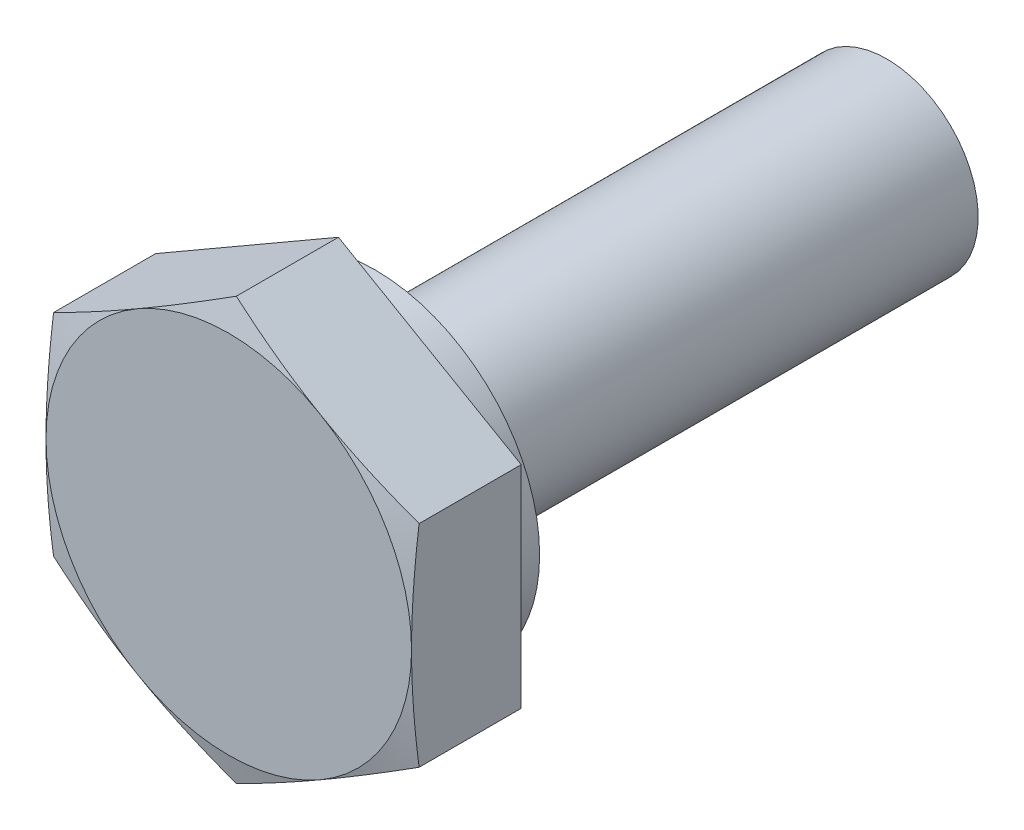
ISO-10303-21;
HEADER;
FILE_DESCRIPTION(('STEP AP214'),'2;1');
FILE_NAME('part.step','',(''),(''),'','','');
FILE_SCHEMA(('AUTOMOTIVE_DESIGN { 1 0 10303 214 1 1 1 1 }'));
ENDSEC;
DATA;
#1=APPLICATION_CONTEXT('core data for automotive mechanical design processes');
#2=APPLICATION_PROTOCOL_DEFINITION('international standard','automotive_design',2000,#1);
#3=PRODUCT_CONTEXT('',#1,'mechanical');
#4=PRODUCT('Part','Part','',(#3));
#5=PRODUCT_RELATED_PRODUCT_CATEGORY('part','',(#4));
#6=PRODUCT_DEFINITION_FORMATION('','',#4);
#7=PRODUCT_DEFINITION_CONTEXT('part definition',#1,'design');
#8=PRODUCT_DEFINITION('design','',#6,#7);
#9=PRODUCT_DEFINITION_SHAPE('','',#8);
#10=(LENGTH_UNIT() NAMED_UNIT(*) SI_UNIT(.MILLI.,.METRE.));
#11=(NAMED_UNIT(*) PLANE_ANGLE_UNIT() SI_UNIT($,.RADIAN.));
#12=(NAMED_UNIT(*) SI_UNIT($,.STERADIAN.) SOLID_ANGLE_UNIT());
#13=UNCERTAINTY_MEASURE_WITH_UNIT(LENGTH_MEASURE(1.E-05),#10,'distance_accuracy_value','');
#14=(GEOMETRIC_REPRESENTATION_CONTEXT(3) GLOBAL_UNCERTAINTY_ASSIGNED_CONTEXT((#13)) GLOBAL_UNIT_ASSIGNED_CONTEXT((#10,
#11,#12)) REPRESENTATION_CONTEXT('',''));
#15=CARTESIAN_POINT('',(0.,0.,0.));
#16=DIRECTION('',(0.,0.,1.));
#17=DIRECTION('',(1.,0.,0.));
#18=AXIS2_PLACEMENT_3D('',#15,#16,#17);
#19=CARTESIAN_POINT('',(0.,0.,-14.));
#20=DIRECTION('',(0.,0.,1.));
#21=DIRECTION('',(1.,0.,0.));
#22=AXIS2_PLACEMENT_3D('',#19,#20,#21);
#23=CYLINDRICAL_SURFACE('',#22,2.5);
#24=CARTESIAN_POINT('',(0.,0.,-14.));
#25=DIRECTION('',(0.,0.,-1.));
#26=DIRECTION('',(-1.,0.,0.));
#27=AXIS2_PLACEMENT_3D('',#24,#25,#26);
#28=CIRCLE('',#27,2.5);
#29=CARTESIAN_POINT('',(-2.5,0.,-14.));
#30=VERTEX_POINT('',#29);
#31=EDGE_CURVE('E12',#30,#30,#28,.T.);
#32=ORIENTED_EDGE('',*,*,#31,.F.);
#33=EDGE_LOOP('',(#32));
#34=FACE_BOUND('',#33,.T.);
#35=CARTESIAN_POINT('',(0.,0.,0.));
#36=DIRECTION('',(0.,0.,-1.));
#37=DIRECTION('',(-1.,0.,0.));
#38=AXIS2_PLACEMENT_3D('',#35,#36,#37);
#39=CIRCLE('',#38,2.5);
#40=CARTESIAN_POINT('',(-2.5,0.,0.));
#41=VERTEX_POINT('',#40);
#42=EDGE_CURVE('E53',#41,#41,#39,.T.);
#43=ORIENTED_EDGE('',*,*,#42,.T.);
#44=EDGE_LOOP('',(#43));
#45=FACE_BOUND('',#44,.T.);
#46=ADVANCED_FACE('F50',(#34,#45),#23,.T.);
#47=CARTESIAN_POINT('',(0.,0.,-14.));
#48=DIRECTION('',(0.,0.,-1.));
#49=DIRECTION('',(-1.,0.,0.));
#50=AXIS2_PLACEMENT_3D('',#47,#48,#49);
#51=PLANE('',#50);
#52=ORIENTED_EDGE('',*,*,#31,.T.);
#53=EDGE_LOOP('',(#52));
#54=FACE_BOUND('',#53,.T.);
#55=ADVANCED_FACE('F65',(#54),#51,.T.);
#56=CARTESIAN_POINT('',(0.,0.,0.));
#57=DIRECTION('',(0.,0.,-1.));
#58=DIRECTION('',(-1.,0.,0.));
#59=AXIS2_PLACEMENT_3D('',#56,#57,#58);
#60=PLANE('',#59);
#61=ORIENTED_EDGE('',*,*,#42,.F.);
#62=EDGE_LOOP('',(#61));
#63=FACE_BOUND('',#62,.T.);
#64=ADVANCED_FACE('F63',(#63),#60,.F.);
#65=CLOSED_SHELL('',(#46,#55,#64));
#66=MANIFOLD_SOLID_BREP('B2',#65);
#67=CARTESIAN_POINT('',(5.,2.88675134594813,4.));
#68=DIRECTION('',(-0.5,-0.866025403784439,0.));
#69=DIRECTION('',(0.866025403784439,-0.5,0.));
#70=AXIS2_PLACEMENT_3D('',#67,#68,#69);
#71=PLANE('',#70);
#72=DIRECTION('',(0.866025403784439,-0.5,0.));
#73=VECTOR('',#72,1.);
#74=CARTESIAN_POINT('',(5.,2.88675134594813,1.));
#75=LINE('',#74,#73);
#76=CARTESIAN_POINT('',(0.,5.7735026918963,1.));
#77=VERTEX_POINT('',#76);
#78=CARTESIAN_POINT('',(5.,2.88675134594813,1.));
#79=VERTEX_POINT('',#78);
#80=EDGE_CURVE('E106',#77,#79,#75,.T.);
#81=ORIENTED_EDGE('',*,*,#80,.F.);
#82=DIRECTION('',(0.,0.,-1.));
#83=VECTOR('',#82,1.);
#84=CARTESIAN_POINT('',(0.,5.77350269189626,4.));
#85=LINE('',#84,#83);
#86=CARTESIAN_POINT('',(0.,5.77350269189626,3.7927405783631));
#87=VERTEX_POINT('',#86);
#88=EDGE_CURVE('E100',#87,#77,#85,.T.);
#89=ORIENTED_EDGE('',*,*,#88,.F.);
#90=CARTESIAN_POINT('',(5.0002,2.88663587589429,3.79270963732724));
#91=CARTESIAN_POINT('',(4.79254599569433,3.00652497117847,3.824847903817));
#92=CARTESIAN_POINT('',(4.58451548167429,3.1266314444476,3.85402418697656));
#93=CARTESIAN_POINT('',(4.16771975103018,3.36726857173206,3.90528422981995));
#94=CARTESIAN_POINT('',(3.95895427067026,3.48779937801537,3.92736510843084));
#95=CARTESIAN_POINT('',(3.54195440146031,3.72855436475577,3.96314523215381));
#96=CARTESIAN_POINT('',(3.33372283258692,3.8487769170986,3.97688714813322));
#97=CARTESIAN_POINT('',(2.91699413634291,4.08937534205412,3.99531365579605));
#98=CARTESIAN_POINT('',(2.70849706817145,4.20975118048816,4.));
#99=CARTESIAN_POINT('',(2.29150293182854,4.45050285735623,4.));
#100=CARTESIAN_POINT('',(2.08300586365708,4.57087869579027,3.99531365579605));
#101=CARTESIAN_POINT('',(1.66627716741308,4.81147712074579,3.97688714813322));
#102=CARTESIAN_POINT('',(1.45804559853969,4.93169967308862,3.96314523215381));
#103=CARTESIAN_POINT('',(1.04104572932974,5.17245465982902,3.92736510843084));
#104=CARTESIAN_POINT('',(0.832280248969817,5.29298546611232,3.90528422981995));
#105=CARTESIAN_POINT('',(0.415484518325706,5.53362259339679,3.85402418697656));
#106=CARTESIAN_POINT('',(0.207454004305663,5.65372906666592,3.824847903817));
#107=CARTESIAN_POINT('',(-0.000200000000001512,5.77361816195009,3.79270963732724));
#108=B_SPLINE_CURVE_WITH_KNOTS('',3,(#90,#91,#92,#93,#94,#95,#96,#97,#98,#99,#100,#101,#102,
#103,#104,#105,#106,#107),.UNSPECIFIED.,.F.,.F.,(4,2,2,2,2,2,2,2,4),(0.,0.725805237679807,
1.45190481561532,2.17425686883392,2.89646911159516,3.6186813543564,4.341033407575,
5.06713298551051,5.79293822319032),.UNSPECIFIED.);
#109=CARTESIAN_POINT('',(2.5,4.3301270189222,4.));
#110=VERTEX_POINT('',#109);
#111=EDGE_CURVE('E210',#110,#87,#108,.T.);
#112=ORIENTED_EDGE('',*,*,#111,.F.);
#113=CARTESIAN_POINT('',(5.,2.88675134594813,3.7927405783631));
#114=VERTEX_POINT('',#113);
#115=EDGE_CURVE('E189',#114,#110,#108,.T.);
#116=ORIENTED_EDGE('',*,*,#115,.F.);
#117=DIRECTION('',(0.,0.,-1.));
#118=VECTOR('',#117,1.);
#119=CARTESIAN_POINT('',(5.,2.88675134594813,4.));
#120=LINE('',#119,#118);
#121=EDGE_CURVE('E185',#114,#79,#120,.T.);
#122=ORIENTED_EDGE('',*,*,#121,.T.);
#123=EDGE_LOOP('',(#81,#89,#112,#116,#122));
#124=FACE_BOUND('',#123,.T.);
#125=ADVANCED_FACE('F92',(#124),#71,.F.);
#126=CARTESIAN_POINT('',(0.,5.77350269189626,4.));
#127=DIRECTION('',(0.5,-0.866025403784439,0.));
#128=DIRECTION('',(0.866025403784439,0.5,0.));
#129=AXIS2_PLACEMENT_3D('',#126,#127,#128);
#130=PLANE('',#129);
#131=DIRECTION('',(0.866025403784439,0.5,0.));
#132=VECTOR('',#131,1.);
#133=CARTESIAN_POINT('',(0.,5.77350269189626,1.));
#134=LINE('',#133,#132);
#135=CARTESIAN_POINT('',(-5.,2.88675134594817,1.));
#136=VERTEX_POINT('',#135);
#137=EDGE_CURVE('E204',#136,#77,#134,.T.);
#138=ORIENTED_EDGE('',*,*,#137,.F.);
#139=DIRECTION('',(0.,0.,-1.));
#140=VECTOR('',#139,1.);
#141=CARTESIAN_POINT('',(-5.,2.88675134594813,4.));
#142=LINE('',#141,#140);
#143=CARTESIAN_POINT('',(-5.,2.88675134594813,3.7927405783631));
#144=VERTEX_POINT('',#143);
#145=EDGE_CURVE('E195',#144,#136,#142,.T.);
#146=ORIENTED_EDGE('',*,*,#145,.F.);
#147=CARTESIAN_POINT('',(0.000200000000069447,5.77361816195014,3.79270963732723));
#148=CARTESIAN_POINT('',(-0.207454004305598,5.65372906666595,3.82484790381699));
#149=CARTESIAN_POINT('',(-0.415484518325645,5.53362259339683,3.85402418697656));
#150=CARTESIAN_POINT('',(-0.832280248969761,5.29298546611236,3.90528422981994));
#151=CARTESIAN_POINT('',(-1.04104572932968,5.17245465982905,3.92736510843083));
#152=CARTESIAN_POINT('',(-1.45804559853964,4.93169967308865,3.9631452321538));
#153=CARTESIAN_POINT('',(-1.66627716741303,4.81147712074582,3.97688714813321));
#154=CARTESIAN_POINT('',(-2.08300586365704,4.5708786957903,3.99531365579605));
#155=CARTESIAN_POINT('',(-2.2915029318285,4.45050285735625,4.));
#156=CARTESIAN_POINT('',(-2.70849706817142,4.20975118048817,4.));
#157=CARTESIAN_POINT('',(-2.91699413634288,4.08937534205413,3.99531365579605));
#158=CARTESIAN_POINT('',(-3.3337228325869,3.84877691709861,3.97688714813322));
#159=CARTESIAN_POINT('',(-3.54195440146029,3.72855436475578,3.96314523215381));
#160=CARTESIAN_POINT('',(-3.95895427067025,3.48779937801537,3.92736510843084));
#161=CARTESIAN_POINT('',(-4.16771975103017,3.36726857173207,3.90528422981995));
#162=CARTESIAN_POINT('',(-4.58451548167429,3.1266314444476,3.85402418697656));
#163=CARTESIAN_POINT('',(-4.79254599569433,3.00652497117847,3.824847903817));
#164=CARTESIAN_POINT('',(-5.0002,2.88663587589429,3.79270963732724));
#165=B_SPLINE_CURVE_WITH_KNOTS('',3,(#147,#148,#149,#150,#151,#152,#153,#154,#155,#156,#157,
#158,#159,#160,#161,#162,#163,#164),.UNSPECIFIED.,.F.,.F.,(4,2,2,2,2,2,2,2,4),(0.,
0.725805237679819,1.45190481561534,2.17425686883395,2.8964691115952,3.61868135435645,
4.34103340757506,5.06713298551058,5.7929382231904),.UNSPECIFIED.);
#166=CARTESIAN_POINT('',(-2.5,4.3301270189222,4.));
#167=VERTEX_POINT('',#166);
#168=EDGE_CURVE('E272',#167,#144,#165,.T.);
#169=ORIENTED_EDGE('',*,*,#168,.F.);
#170=EDGE_CURVE('E206',#87,#167,#165,.T.);
#171=ORIENTED_EDGE('',*,*,#170,.F.);
#172=ORIENTED_EDGE('',*,*,#88,.T.);
#173=EDGE_LOOP('',(#138,#146,#169,#171,#172));
#174=FACE_BOUND('',#173,.T.);
#175=ADVANCED_FACE('F202',(#174),#130,.F.);
#176=CARTESIAN_POINT('',(-5.,2.88675134594813,4.));
#177=DIRECTION('',(1.,0.,0.));
#178=DIRECTION('',(0.,1.,0.));
#179=AXIS2_PLACEMENT_3D('',#176,#177,#178);
#180=PLANE('',#179);
#181=DIRECTION('',(0.,1.,0.));
#182=VECTOR('',#181,1.);
#183=CARTESIAN_POINT('',(-5.,2.88675134594813,1.));
#184=LINE('',#183,#182);
#185=CARTESIAN_POINT('',(-5.00000000000007,-2.88675134594809,1.));
#186=VERTEX_POINT('',#185);
#187=EDGE_CURVE('E215',#186,#136,#184,.T.);
#188=ORIENTED_EDGE('',*,*,#187,.F.);
#189=DIRECTION('',(0.,0.,-1.));
#190=VECTOR('',#189,1.);
#191=CARTESIAN_POINT('',(-5.,-2.88675134594813,4.));
#192=LINE('',#191,#190);
#193=CARTESIAN_POINT('',(-5.,-2.88675134594813,3.7927405783631));
#194=VERTEX_POINT('',#193);
#195=EDGE_CURVE('E187',#194,#186,#192,.T.);
#196=ORIENTED_EDGE('',*,*,#195,.F.);
#197=CARTESIAN_POINT('',(-5.,-7.76196101902946,2.86577469806163));
#198=CARTESIAN_POINT('',(-5.,-7.53355544640549,2.91721159108631));
#199=CARTESIAN_POINT('',(-5.,-7.30501038221311,2.96803982960013));
#200=CARTESIAN_POINT('',(-5.,-6.84757243988184,3.06815002834736));
#201=CARTESIAN_POINT('',(-5.,-6.6186795479039,3.11743192527288));
#202=CARTESIAN_POINT('',(-5.,-6.16029542621132,3.2141584906747));
#203=CARTESIAN_POINT('',(-5.,-5.93080384827886,3.26160151463753));
#204=CARTESIAN_POINT('',(-5.,-5.47135179494064,3.35415884682467));
#205=CARTESIAN_POINT('',(-5.,-5.24139132327865,3.39927317356675));
#206=CARTESIAN_POINT('',(-5.,-4.78296185288845,3.4862279803799));
#207=CARTESIAN_POINT('',(-5.,-4.55449771093611,3.52809394386246));
#208=CARTESIAN_POINT('',(-5.,-4.09695356811832,3.60830702239458));
#209=CARTESIAN_POINT('',(-5.,-3.8678735803398,3.6466542116203));
#210=CARTESIAN_POINT('',(-5.,-3.40903362894303,3.71899424972782));
#211=CARTESIAN_POINT('',(-5.,-3.17927370171718,3.75298732749157));
#212=CARTESIAN_POINT('',(-5.,-2.71901942818869,3.81564030016865));
#213=CARTESIAN_POINT('',(-5.,-2.48852508038888,3.84430018420281));
#214=CARTESIAN_POINT('',(-5.,-2.02412764678303,3.89550663603561));
#215=CARTESIAN_POINT('',(-5.,-1.79021614970132,3.91797803433157));
#216=CARTESIAN_POINT('',(-5.,-1.32177884743611,3.95527197023481));
#217=CARTESIAN_POINT('',(-5.,-1.08725305663507,3.97009468533984));
#218=CARTESIAN_POINT('',(-5.,-0.617940238864208,3.99122886719137));
#219=CARTESIAN_POINT('',(-5.,-0.383153427774166,3.99754503116479));
#220=CARTESIAN_POINT('',(-5.,0.0864917880275065,4.0012761427966));
#221=CARTESIAN_POINT('',(-5.,0.321350192547566,3.99869111406739));
#222=CARTESIAN_POINT('',(-5.,0.791864859324612,3.98475725372217));
#223=CARTESIAN_POINT('',(-5.,1.02751992497615,3.97336883174136));
#224=CARTESIAN_POINT('',(-5.,1.49830029770566,3.94247990079264));
#225=CARTESIAN_POINT('',(-5.,1.73342557530454,3.92297895110384));
#226=CARTESIAN_POINT('',(-5.,2.20314223911287,3.87688099141532));
#227=CARTESIAN_POINT('',(-5.,2.43773310846898,3.8502787970731));
#228=CARTESIAN_POINT('',(-5.,2.90615246571505,3.79112401718162));
#229=CARTESIAN_POINT('',(-5.,3.13998095657708,3.75857145485751));
#230=CARTESIAN_POINT('',(-5.,3.65460300414174,3.68145146605038));
#231=CARTESIAN_POINT('',(-5.,3.93523107751749,3.63578811875538));
#232=CARTESIAN_POINT('',(-5.,4.49555085135319,3.53901354861882));
#233=CARTESIAN_POINT('',(-5.,4.77524249961658,3.48790202714241));
#234=CARTESIAN_POINT('',(-5.,5.33388376285402,3.38148396717443));
#235=CARTESIAN_POINT('',(-5.,5.61283320547354,3.32617652965581));
#236=CARTESIAN_POINT('',(-5.,6.17006410655163,3.21233708867529));
#237=CARTESIAN_POINT('',(-5.,6.44834557822614,3.1538051495688));
#238=CARTESIAN_POINT('',(-5.,7.00453379399633,3.03419996867862));
#239=CARTESIAN_POINT('',(-5.,7.282440215283,2.97312523089704));
#240=CARTESIAN_POINT('',(-5.,7.83781244025366,2.8490010536128));
#241=CARTESIAN_POINT('',(-5.,8.1152782409337,2.78595160070767));
#242=CARTESIAN_POINT('',(-5.,8.94706574997596,2.59449096007915));
#243=CARTESIAN_POINT('',(-5.,9.50085096348015,2.46375145902359));
#244=CARTESIAN_POINT('',(-5.,10.5991357140364,2.20023970984687));
#245=CARTESIAN_POINT('',(-5.,11.1436497579981,2.06752751261781));
#246=CARTESIAN_POINT('',(-5.,12.2320324679224,1.79939890524727));
#247=CARTESIAN_POINT('',(-5.,12.7759011088251,1.66398239352181));
#248=CARTESIAN_POINT('',(-5.,13.8621201011647,1.39149952710366));
#249=CARTESIAN_POINT('',(-5.,14.404471368774,1.25443681635721));
#250=CARTESIAN_POINT('',(-5.,15.4887837905263,0.978887236203113));
#251=CARTESIAN_POINT('',(-5.,16.0307449625641,0.840400437255483));
#252=CARTESIAN_POINT('',(-5.,16.5725819500003,0.70143420342687));
#253=B_SPLINE_CURVE_WITH_KNOTS('',3,(#197,#198,#199,#200,#201,#202,#203,#204,#205,#206,#207,
#208,#209,#210,#211,#212,#213,#214,#215,#216,#217,#218,#219,#220,#221,#222,#223,#224,#225,#226,
#227,#228,#229,#230,#231,#232,#233,#234,#235,#236,#237,#238,#239,#240,#241,#242,#243,#244,#245,
#246,#247,#248,#249,#250,#251,#252),.UNSPECIFIED.,.F.,.F.,(4,2,2,2,2,2,2,2,2,2,2,2,2,2,2,2,2,2,
2,2,2,2,2,2,2,2,2,4),(0.,0.702379911672641,1.40478854166005,2.10781148965147,2.81082884635111,
3.50761218784096,4.20438083768466,4.90111284554521,5.59784627465138,6.30270276935083,
7.00754290619364,7.71199367802689,8.41644258114918,9.1240780747969,9.8317520164465,
10.539944023025,11.2481332654865,12.1010172051948,12.9539479187311,13.8070619022057,
14.6601588651796,15.5137650240013,16.3673769775346,18.0743755141688,19.7557280175381,
21.4371437979221,23.1153490570786,24.7934716789311),.UNSPECIFIED.);
#254=CARTESIAN_POINT('',(-5.,0.,4.));
#255=VERTEX_POINT('',#254);
#256=EDGE_CURVE('E264',#255,#194,#253,.F.);
#257=ORIENTED_EDGE('',*,*,#256,.F.);
#258=EDGE_CURVE('E270',#144,#255,#253,.F.);
#259=ORIENTED_EDGE('',*,*,#258,.F.);
#260=ORIENTED_EDGE('',*,*,#145,.T.);
#261=EDGE_LOOP('',(#188,#196,#257,#259,#260));
#262=FACE_BOUND('',#261,.T.);
#263=ADVANCED_FACE('F277',(#262),#180,.F.);
#264=CARTESIAN_POINT('',(-5.,-2.88675134594813,4.));
#265=DIRECTION('',(0.5,0.866025403784439,0.));
#266=DIRECTION('',(-0.866025403784439,0.5,0.));
#267=AXIS2_PLACEMENT_3D('',#264,#265,#266);
#268=PLANE('',#267);
#269=DIRECTION('',(-0.866025403784439,0.5,0.));
#270=VECTOR('',#269,1.);
#271=CARTESIAN_POINT('',(-5.,-2.88675134594813,1.));
#272=LINE('',#271,#270);
#273=CARTESIAN_POINT('',(0.,-5.7735026918963,1.));
#274=VERTEX_POINT('',#273);
#275=EDGE_CURVE('E178',#274,#186,#272,.T.);
#276=ORIENTED_EDGE('',*,*,#275,.F.);
#277=DIRECTION('',(0.,0.,-1.));
#278=VECTOR('',#277,1.);
#279=CARTESIAN_POINT('',(0.,-5.77350269189626,4.));
#280=LINE('',#279,#278);
#281=CARTESIAN_POINT('',(0.,-5.77350269189626,3.7927405783631));
#282=VERTEX_POINT('',#281);
#283=EDGE_CURVE('E177',#282,#274,#280,.T.);
#284=ORIENTED_EDGE('',*,*,#283,.F.);
#285=CARTESIAN_POINT('',(-5.00020000000007,-2.88663587589425,3.79270963732723));
#286=CARTESIAN_POINT('',(-4.7925459956944,-3.00652497117843,3.82484790381699));
#287=CARTESIAN_POINT('',(-4.58451548167436,-3.12663144444756,3.85402418697656));
#288=CARTESIAN_POINT('',(-4.16771975103024,-3.36726857173203,3.90528422981994));
#289=CARTESIAN_POINT('',(-3.95895427067032,-3.48779937801533,3.92736510843083));
#290=CARTESIAN_POINT('',(-3.54195440146036,-3.72855436475574,3.9631452321538));
#291=CARTESIAN_POINT('',(-3.33372283258697,-3.84877691709857,3.97688714813321));
#292=CARTESIAN_POINT('',(-2.91699413634295,-4.08937534205409,3.99531365579605));
#293=CARTESIAN_POINT('',(-2.70849706817149,-4.20975118048813,4.));
#294=CARTESIAN_POINT('',(-2.29150293182857,-4.45050285735621,4.));
#295=CARTESIAN_POINT('',(-2.08300586365711,-4.57087869579026,3.99531365579605));
#296=CARTESIAN_POINT('',(-1.6662771674131,-4.81147712074578,3.97688714813322));
#297=CARTESIAN_POINT('',(-1.45804559853971,-4.93169967308861,3.96314523215381));
#298=CARTESIAN_POINT('',(-1.04104572932975,-5.17245465982902,3.92736510843084));
#299=CARTESIAN_POINT('',(-0.832280248969828,-5.29298546611232,3.90528422981995));
#300=CARTESIAN_POINT('',(-0.415484518325712,-5.53362259339679,3.85402418697656));
#301=CARTESIAN_POINT('',(-0.207454004305665,-5.65372906666592,3.824847903817));
#302=CARTESIAN_POINT('',(0.000200000000002154,-5.7736181619501,3.79270963732724));
#303=B_SPLINE_CURVE_WITH_KNOTS('',3,(#285,#286,#287,#288,#289,#290,#291,#292,#293,#294,#295,
#296,#297,#298,#299,#300,#301,#302),.UNSPECIFIED.,.F.,.F.,(4,2,2,2,2,2,2,2,4),(0.,
0.725805237679818,1.45190481561534,2.17425686883395,2.8964691115952,3.61868135435645,
4.34103340757507,5.06713298551059,5.7929382231904),.UNSPECIFIED.);
#304=CARTESIAN_POINT('',(-2.5,-4.3301270189222,4.));
#305=VERTEX_POINT('',#304);
#306=EDGE_CURVE('E257',#305,#282,#303,.T.);
#307=ORIENTED_EDGE('',*,*,#306,.F.);
#308=EDGE_CURVE('E271',#194,#305,#303,.T.);
#309=ORIENTED_EDGE('',*,*,#308,.F.);
#310=ORIENTED_EDGE('',*,*,#195,.T.);
#311=EDGE_LOOP('',(#276,#284,#307,#309,#310));
#312=FACE_BOUND('',#311,.T.);
#313=ADVANCED_FACE('F280',(#312),#268,.F.);
#314=CARTESIAN_POINT('',(0.,-5.77350269189626,4.));
#315=DIRECTION('',(-0.5,0.866025403784439,0.));
#316=DIRECTION('',(-0.866025403784439,-0.5,0.));
#317=AXIS2_PLACEMENT_3D('',#314,#315,#316);
#318=PLANE('',#317);
#319=DIRECTION('',(-0.866025403784439,-0.5,0.));
#320=VECTOR('',#319,1.);
#321=CARTESIAN_POINT('',(0.,-5.77350269189626,1.));
#322=LINE('',#321,#320);
#323=CARTESIAN_POINT('',(5.,-2.88675134594817,1.));
#324=VERTEX_POINT('',#323);
#325=EDGE_CURVE('E163',#324,#274,#322,.T.);
#326=ORIENTED_EDGE('',*,*,#325,.F.);
#327=DIRECTION('',(0.,0.,-1.));
#328=VECTOR('',#327,1.);
#329=CARTESIAN_POINT('',(5.,-2.88675134594813,4.));
#330=LINE('',#329,#328);
#331=CARTESIAN_POINT('',(5.,-2.88675134594813,3.7927405783631));
#332=VERTEX_POINT('',#331);
#333=EDGE_CURVE('E174',#332,#324,#330,.T.);
#334=ORIENTED_EDGE('',*,*,#333,.F.);
#335=CARTESIAN_POINT('',(-0.000200000000069509,-5.77361816195014,3.79270963732723));
#336=CARTESIAN_POINT('',(0.207454004305598,-5.65372906666596,3.82484790381699));
#337=CARTESIAN_POINT('',(0.415484518325644,-5.53362259339683,3.85402418697655));
#338=CARTESIAN_POINT('',(0.83228024896976,-5.29298546611236,3.90528422981994));
#339=CARTESIAN_POINT('',(1.04104572932968,-5.17245465982906,3.92736510843083));
#340=CARTESIAN_POINT('',(1.45804559853964,-4.93169967308865,3.9631452321538));
#341=CARTESIAN_POINT('',(1.66627716741303,-4.81147712074582,3.97688714813321));
#342=CARTESIAN_POINT('',(2.08300586365704,-4.5708786957903,3.99531365579605));
#343=CARTESIAN_POINT('',(2.2915029318285,-4.45050285735625,4.));
#344=CARTESIAN_POINT('',(2.70849706817142,-4.20975118048818,4.));
#345=CARTESIAN_POINT('',(2.91699413634288,-4.08937534205413,3.99531365579605));
#346=CARTESIAN_POINT('',(3.3337228325869,-3.84877691709861,3.97688714813322));
#347=CARTESIAN_POINT('',(3.54195440146029,-3.72855436475578,3.96314523215381));
#348=CARTESIAN_POINT('',(3.95895427067025,-3.48779937801537,3.92736510843084));
#349=CARTESIAN_POINT('',(4.16771975103017,-3.36726857173207,3.90528422981995));
#350=CARTESIAN_POINT('',(4.58451548167429,-3.1266314444476,3.85402418697656));
#351=CARTESIAN_POINT('',(4.79254599569433,-3.00652497117847,3.824847903817));
#352=CARTESIAN_POINT('',(5.0002,-2.88663587589429,3.79270963732724));
#353=B_SPLINE_CURVE_WITH_KNOTS('',3,(#335,#336,#337,#338,#339,#340,#341,#342,#343,#344,#345,
#346,#347,#348,#349,#350,#351,#352),.UNSPECIFIED.,.F.,.F.,(4,2,2,2,2,2,2,2,4),(0.,
0.725805237679818,1.45190481561534,2.17425686883395,2.8964691115952,3.61868135435645,
4.34103340757506,5.06713298551058,5.7929382231904),.UNSPECIFIED.);
#354=CARTESIAN_POINT('',(2.5,-4.3301270189222,4.));
#355=VERTEX_POINT('',#354);
#356=EDGE_CURVE('E228',#355,#332,#353,.T.);
#357=ORIENTED_EDGE('',*,*,#356,.F.);
#358=EDGE_CURVE('E409',#282,#355,#353,.T.);
#359=ORIENTED_EDGE('',*,*,#358,.F.);
#360=ORIENTED_EDGE('',*,*,#283,.T.);
#361=EDGE_LOOP('',(#326,#334,#357,#359,#360));
#362=FACE_BOUND('',#361,.T.);
#363=ADVANCED_FACE('F172',(#362),#318,.F.);
#364=CARTESIAN_POINT('',(5.,-2.88675134594813,4.));
#365=DIRECTION('',(-1.,0.,0.));
#366=DIRECTION('',(0.,-1.,0.));
#367=AXIS2_PLACEMENT_3D('',#364,#365,#366);
#368=PLANE('',#367);
#369=DIRECTION('',(0.,-1.,0.));
#370=VECTOR('',#369,1.);
#371=CARTESIAN_POINT('',(5.,-2.88675134594813,1.));
#372=LINE('',#371,#370);
#373=EDGE_CURVE('E48',#79,#324,#372,.T.);
#374=ORIENTED_EDGE('',*,*,#373,.F.);
#375=ORIENTED_EDGE('',*,*,#121,.F.);
#376=CARTESIAN_POINT('',(5.,-7.76196102111728,2.86577469759133));
#377=CARTESIAN_POINT('',(5.,-7.53355544840877,2.9172115906391));
#378=CARTESIAN_POINT('',(5.,-7.30501038413182,2.96803982917593));
#379=CARTESIAN_POINT('',(5.,-6.8475724416313,3.06815002796884));
#380=CARTESIAN_POINT('',(5.,-6.61867954956868,3.11743192491704));
#381=CARTESIAN_POINT('',(5.,-6.16029542770635,3.21415849036376));
#382=CARTESIAN_POINT('',(5.,-5.93080384968881,3.26160151434882));
#383=CARTESIAN_POINT('',(5.,-5.47135179618023,3.35415884657963));
#384=CARTESIAN_POINT('',(5.,-5.24139132443295,3.39927317334315));
#385=CARTESIAN_POINT('',(5.,-4.78296185387427,3.48622798019752));
#386=CARTESIAN_POINT('',(5.,-4.55449771183872,3.52809394369987));
#387=CARTESIAN_POINT('',(5.,-4.09695356885418,3.60830702226992));
#388=CARTESIAN_POINT('',(5.,-3.86787358099211,3.64665421151377));
#389=CARTESIAN_POINT('',(5.,-3.40903362942781,3.71899424965508));
#390=CARTESIAN_POINT('',(5.,-3.17927370211798,3.75298732743452));
#391=CARTESIAN_POINT('',(5.,-2.719019428421,3.81564030013952));
#392=CARTESIAN_POINT('',(5.,-2.48852508053668,3.84430018418593));
#393=CARTESIAN_POINT('',(5.,-2.02412764675223,3.8955066360396));
#394=CARTESIAN_POINT('',(5.,-1.79021614957641,3.91797803434391));
#395=CARTESIAN_POINT('',(5.,-1.32177884712254,3.95527197025738));
#396=CARTESIAN_POINT('',(5.,-1.08725305622693,3.97009468536428));
#397=CARTESIAN_POINT('',(5.,-0.617940238266999,3.99122886721221));
#398=CARTESIAN_POINT('',(5.,-0.383153427082432,3.99754503118016));
#399=CARTESIAN_POINT('',(5.,0.0864917889079704,4.00127614279372));
#400=CARTESIAN_POINT('',(5.,0.321350193522235,3.99869111405172));
#401=CARTESIAN_POINT('',(5.,0.791864860487837,3.98475725367446));
#402=CARTESIAN_POINT('',(5.,1.02751992623373,3.97336883167437));
#403=CARTESIAN_POINT('',(5.,1.49830029915108,3.94247990068226));
#404=CARTESIAN_POINT('',(5.,1.73342557684346,3.92297895096935));
#405=CARTESIAN_POINT('',(5.,2.20314224083825,3.87688099122943));
#406=CARTESIAN_POINT('',(5.,2.43773311028731,3.85027879685992));
#407=CARTESIAN_POINT('',(5.,2.90615246771866,3.79112401691214));
#408=CARTESIAN_POINT('',(5.,3.13998095867299,3.75857145455901));
#409=CARTESIAN_POINT('',(5.,3.6546030063271,3.68145146570409));
#410=CARTESIAN_POINT('',(5.,3.93523107970032,3.63578811839301));
#411=CARTESIAN_POINT('',(5.,4.49555085353131,3.539013548228));
#412=CARTESIAN_POINT('',(5.,4.77524250179251,3.48790202673923));
#413=CARTESIAN_POINT('',(5.,5.33388376502587,3.38148396674939));
#414=CARTESIAN_POINT('',(5.,5.61283320764349,3.32617652922128));
#415=CARTESIAN_POINT('',(5.,6.17006410871813,3.21233708822392));
#416=CARTESIAN_POINT('',(5.,6.4483455803911,3.15380514911008));
#417=CARTESIAN_POINT('',(5.,7.00453379615783,3.03419996820695));
#418=CARTESIAN_POINT('',(5.,7.2824402174426,2.97312523041978));
#419=CARTESIAN_POINT('',(5.,7.83781244240968,2.84900105312556));
#420=CARTESIAN_POINT('',(5.,8.11527824308804,2.78595160021605));
#421=CARTESIAN_POINT('',(5.,8.94706575212567,2.59449095957572));
#422=CARTESIAN_POINT('',(5.,9.50085096562718,2.46375145851409));
#423=CARTESIAN_POINT('',(5.,10.5991357161746,2.20023970932834));
#424=CARTESIAN_POINT('',(4.99999999999999,11.1436497601303,2.06752751209632));
#425=CARTESIAN_POINT('',(4.99999999999999,12.2320324700426,1.79939890472117));
#426=CARTESIAN_POINT('',(4.99999999999999,12.7759011109396,1.66398239299406));
#427=CARTESIAN_POINT('',(4.99999999999999,13.8621201032699,1.39149952657289));
#428=CARTESIAN_POINT('',(4.99999999999999,14.4044713708757,1.25443681582507));
#429=CARTESIAN_POINT('',(4.99999999999999,15.4887837926214,0.978887235668783));
#430=CARTESIAN_POINT('',(4.99999999999999,16.0307449646559,0.840400436720336));
#431=CARTESIAN_POINT('',(4.99999999999999,16.572581952089,0.701434202891063));
#432=B_SPLINE_CURVE_WITH_KNOTS('',3,(#376,#377,#378,#379,#380,#381,#382,#383,#384,#385,#386,
#387,#388,#389,#390,#391,#392,#393,#394,#395,#396,#397,#398,#399,#400,#401,#402,#403,#404,#405,
#406,#407,#408,#409,#410,#411,#412,#413,#414,#415,#416,#417,#418,#419,#420,#421,#422,#423,#424,
#425,#426,#427,#428,#429,#430,#431),.UNSPECIFIED.,.F.,.F.,(4,2,2,2,2,2,2,2,2,2,2,2,2,2,2,2,2,2,
2,2,2,2,2,2,2,2,2,4),(0.,0.702379911935285,1.40478854218536,2.10781149044022,2.8108288474033,
3.50761218914936,4.20438083924924,4.90111284736585,5.59784627672808,6.30270277171084,
7.00754290883691,7.71199368095297,8.41644258435809,9.12407807829117,9.83175202022621,
10.539944027091,11.2481332698388,12.1010172095474,12.9539479230841,13.8070619065586,
14.6601588695325,15.5137650283522,16.3673769818836,18.0743755185141,19.7557280218678,
21.4371438022361,23.1153490613837,24.7934716832274),.UNSPECIFIED.);
#433=CARTESIAN_POINT('',(5.,0.,4.));
#434=VERTEX_POINT('',#433);
#435=EDGE_CURVE('E219',#434,#114,#432,.T.);
#436=ORIENTED_EDGE('',*,*,#435,.F.);
#437=EDGE_CURVE('E184',#332,#434,#432,.T.);
#438=ORIENTED_EDGE('',*,*,#437,.F.);
#439=ORIENTED_EDGE('',*,*,#333,.T.);
#440=EDGE_LOOP('',(#374,#375,#436,#438,#439));
#441=FACE_BOUND('',#440,.T.);
#442=ADVANCED_FACE('F182',(#441),#368,.F.);
#443=CARTESIAN_POINT('',(0.,0.,4.));
#444=DIRECTION('',(0.,0.,-1.));
#445=DIRECTION('',(1.,0.,0.));
#446=AXIS2_PLACEMENT_3D('',#443,#444,#445);
#447=CONICAL_SURFACE('',#446,5.,1.30899693899575);
#448=ORIENTED_EDGE('',*,*,#356,.T.);
#449=ORIENTED_EDGE('',*,*,#437,.T.);
#450=CARTESIAN_POINT('',(0.,0.,4.));
#451=DIRECTION('',(0.,0.,1.));
#452=DIRECTION('',(1.,0.,0.));
#453=AXIS2_PLACEMENT_3D('',#450,#451,#452);
#454=CIRCLE('',#453,5.);
#455=EDGE_CURVE('E114',#355,#434,#454,.T.);
#456=ORIENTED_EDGE('',*,*,#455,.F.);
#457=EDGE_LOOP('',(#448,#449,#456));
#458=FACE_BOUND('',#457,.T.);
#459=ADVANCED_FACE('F245',(#458),#447,.T.);
#460=ORIENTED_EDGE('',*,*,#306,.T.);
#461=ORIENTED_EDGE('',*,*,#358,.T.);
#462=EDGE_CURVE('E212',#305,#355,#454,.T.);
#463=ORIENTED_EDGE('',*,*,#462,.F.);
#464=EDGE_LOOP('',(#460,#461,#463));
#465=FACE_BOUND('',#464,.T.);
#466=ADVANCED_FACE('F384',(#465),#447,.T.);
#467=ORIENTED_EDGE('',*,*,#256,.T.);
#468=ORIENTED_EDGE('',*,*,#308,.T.);
#469=EDGE_CURVE('E415',#255,#305,#454,.T.);
#470=ORIENTED_EDGE('',*,*,#469,.F.);
#471=EDGE_LOOP('',(#467,#468,#470));
#472=FACE_BOUND('',#471,.T.);
#473=ADVANCED_FACE('F376',(#472),#447,.T.);
#474=ORIENTED_EDGE('',*,*,#168,.T.);
#475=ORIENTED_EDGE('',*,*,#258,.T.);
#476=EDGE_CURVE('E421',#167,#255,#454,.T.);
#477=ORIENTED_EDGE('',*,*,#476,.F.);
#478=EDGE_LOOP('',(#474,#475,#477));
#479=FACE_BOUND('',#478,.T.);
#480=ADVANCED_FACE('F368',(#479),#447,.T.);
#481=ORIENTED_EDGE('',*,*,#111,.T.);
#482=ORIENTED_EDGE('',*,*,#170,.T.);
#483=EDGE_CURVE('E220',#110,#167,#454,.T.);
#484=ORIENTED_EDGE('',*,*,#483,.F.);
#485=EDGE_LOOP('',(#481,#482,#484));
#486=FACE_BOUND('',#485,.T.);
#487=ADVANCED_FACE('F243',(#486),#447,.T.);
#488=ORIENTED_EDGE('',*,*,#115,.T.);
#489=EDGE_CURVE('E214',#434,#110,#454,.T.);
#490=ORIENTED_EDGE('',*,*,#489,.F.);
#491=ORIENTED_EDGE('',*,*,#435,.T.);
#492=EDGE_LOOP('',(#488,#490,#491));
#493=FACE_BOUND('',#492,.T.);
#494=ADVANCED_FACE('F237',(#493),#447,.T.);
#495=CARTESIAN_POINT('',(0.,0.,4.));
#496=DIRECTION('',(0.,0.,1.));
#497=DIRECTION('',(1.,0.,0.));
#498=AXIS2_PLACEMENT_3D('',#495,#496,#497);
#499=PLANE('',#498);
#500=ORIENTED_EDGE('',*,*,#455,.T.);
#501=ORIENTED_EDGE('',*,*,#489,.T.);
#502=ORIENTED_EDGE('',*,*,#483,.T.);
#503=ORIENTED_EDGE('',*,*,#476,.T.);
#504=ORIENTED_EDGE('',*,*,#469,.T.);
#505=ORIENTED_EDGE('',*,*,#462,.T.);
#506=EDGE_LOOP('',(#500,#501,#502,#503,#504,#505));
#507=FACE_BOUND('',#506,.T.);
#508=ADVANCED_FACE('F242',(#507),#499,.T.);
#509=CARTESIAN_POINT('',(0.,0.,1.));
#510=DIRECTION('',(0.,0.,-1.));
#511=DIRECTION('',(-1.,0.,0.));
#512=AXIS2_PLACEMENT_3D('',#509,#510,#511);
#513=PLANE('',#512);
#514=CARTESIAN_POINT('',(0.,0.,1.));
#515=DIRECTION('',(0.,0.,-1.));
#516=DIRECTION('',(-1.,0.,0.));
#517=AXIS2_PLACEMENT_3D('',#514,#515,#516);
#518=CIRCLE('',#517,4.50314517898536);
#519=CARTESIAN_POINT('',(-4.50314517898536,0.,1.));
#520=VERTEX_POINT('',#519);
#521=EDGE_CURVE('E179',#520,#520,#518,.T.);
#522=ORIENTED_EDGE('',*,*,#521,.F.);
#523=EDGE_LOOP('',(#522));
#524=FACE_BOUND('',#523,.T.);
#525=ORIENTED_EDGE('',*,*,#80,.T.);
#526=ORIENTED_EDGE('',*,*,#373,.T.);
#527=ORIENTED_EDGE('',*,*,#325,.T.);
#528=ORIENTED_EDGE('',*,*,#275,.T.);
#529=ORIENTED_EDGE('',*,*,#187,.T.);
#530=ORIENTED_EDGE('',*,*,#137,.T.);
#531=EDGE_LOOP('',(#525,#526,#527,#528,#529,#530));
#532=FACE_BOUND('',#531,.T.);
#533=ADVANCED_FACE('F162',(#524,#532),#513,.T.);
#534=CARTESIAN_POINT('',(0.,0.,1.));
#535=DIRECTION('',(0.,0.,-1.));
#536=DIRECTION('',(-1.,0.,0.));
#537=AXIS2_PLACEMENT_3D('',#534,#535,#536);
#538=CYLINDRICAL_SURFACE('',#537,4.50314517898536);
#539=ORIENTED_EDGE('',*,*,#521,.T.);
#540=EDGE_LOOP('',(#539));
#541=FACE_BOUND('',#540,.T.);
#542=CARTESIAN_POINT('',(0.,0.,0.));
#543=DIRECTION('',(0.,0.,-1.));
#544=DIRECTION('',(-1.,0.,0.));
#545=AXIS2_PLACEMENT_3D('',#542,#543,#544);
#546=CIRCLE('',#545,4.50314517898536);
#547=CARTESIAN_POINT('',(-4.50314517898536,0.,0.));
#548=VERTEX_POINT('',#547);
#549=EDGE_CURVE('E425',#548,#548,#546,.T.);
#550=ORIENTED_EDGE('',*,*,#549,.F.);
#551=EDGE_LOOP('',(#550));
#552=FACE_BOUND('',#551,.T.);
#553=ADVANCED_FACE('F338',(#541,#552),#538,.T.);
#554=CARTESIAN_POINT('',(0.,0.,0.));
#555=DIRECTION('',(0.,0.,1.));
#556=DIRECTION('',(1.,0.,0.));
#557=AXIS2_PLACEMENT_3D('',#554,#555,#556);
#558=PLANE('',#557);
#559=ORIENTED_EDGE('',*,*,#549,.T.);
#560=EDGE_LOOP('',(#559));
#561=FACE_BOUND('',#560,.T.);
#562=ADVANCED_FACE('F347',(#561),#558,.F.);
#563=CLOSED_SHELL('',(#125,#175,#263,#313,#363,#442,#459,#466,#473,#480,#487,#494,#508,#533,
#553,#562));
#564=MANIFOLD_SOLID_BREP('B7',#563);
#565=ADVANCED_BREP_SHAPE_REPRESENTATION('',(#18,#66,#564),#14);
#566=SHAPE_DEFINITION_REPRESENTATION(#9,#565);
ENDSEC;
END-ISO-10303-21;
